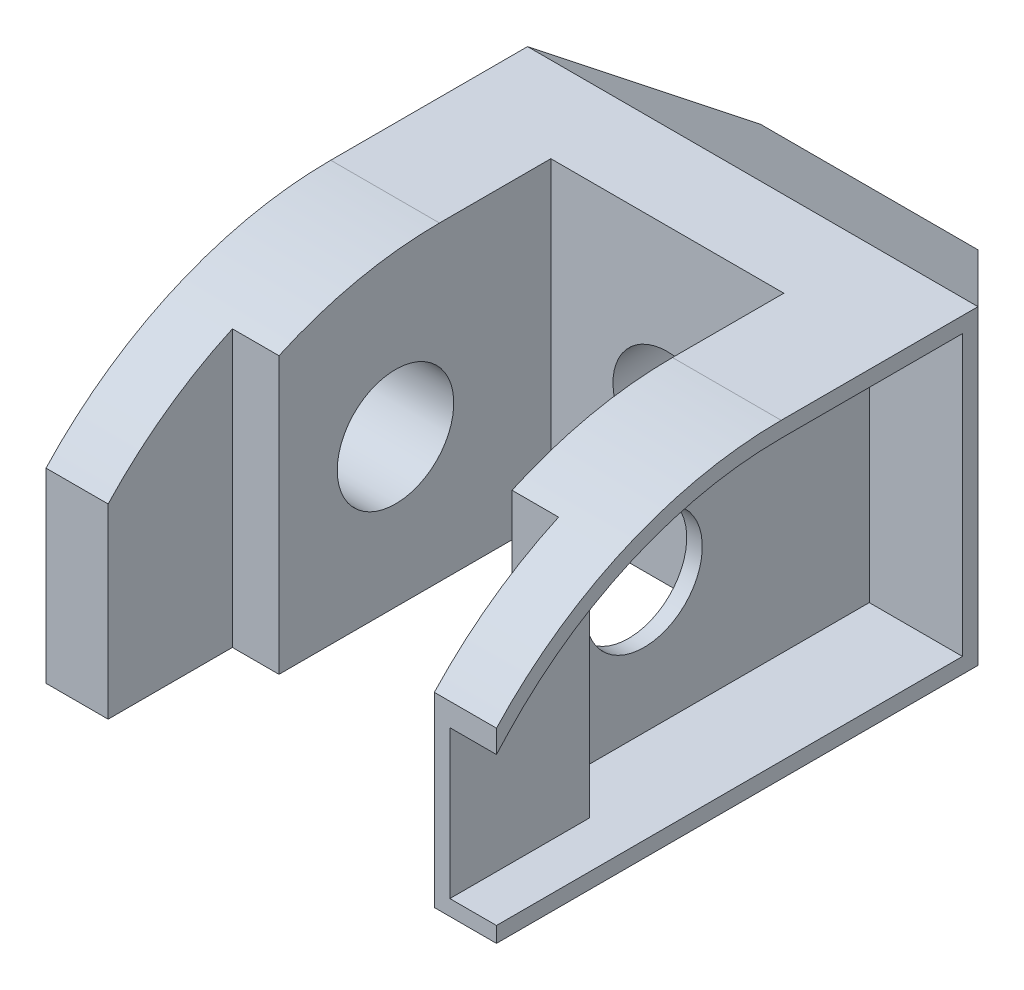
ISO-10303-21;
HEADER;
FILE_DESCRIPTION(('STEP AP214'),'2;1');
FILE_NAME('part.step','',(''),(''),'','','');
FILE_SCHEMA(('AUTOMOTIVE_DESIGN { 1 0 10303 214 1 1 1 1 }'));
ENDSEC;
DATA;
#1=APPLICATION_CONTEXT('core data for automotive mechanical design processes');
#2=APPLICATION_PROTOCOL_DEFINITION('international standard','automotive_design',2000,#1);
#3=PRODUCT_CONTEXT('',#1,'mechanical');
#4=PRODUCT('Part','Part','',(#3));
#5=PRODUCT_RELATED_PRODUCT_CATEGORY('part','',(#4));
#6=PRODUCT_DEFINITION_FORMATION('','',#4);
#7=PRODUCT_DEFINITION_CONTEXT('part definition',#1,'design');
#8=PRODUCT_DEFINITION('design','',#6,#7);
#9=PRODUCT_DEFINITION_SHAPE('','',#8);
#10=(LENGTH_UNIT() NAMED_UNIT(*) SI_UNIT(.MILLI.,.METRE.));
#11=(NAMED_UNIT(*) PLANE_ANGLE_UNIT() SI_UNIT($,.RADIAN.));
#12=(NAMED_UNIT(*) SI_UNIT($,.STERADIAN.) SOLID_ANGLE_UNIT());
#13=UNCERTAINTY_MEASURE_WITH_UNIT(LENGTH_MEASURE(1.E-05),#10,'distance_accuracy_value','');
#14=(GEOMETRIC_REPRESENTATION_CONTEXT(3) GLOBAL_UNCERTAINTY_ASSIGNED_CONTEXT((#13)) GLOBAL_UNIT_ASSIGNED_CONTEXT((#10,
#11,#12)) REPRESENTATION_CONTEXT('',''));
#15=CARTESIAN_POINT('',(0.,0.,0.));
#16=DIRECTION('',(0.,0.,1.));
#17=DIRECTION('',(1.,0.,0.));
#18=AXIS2_PLACEMENT_3D('',#15,#16,#17);
#19=CARTESIAN_POINT('',(29.,0.,0.));
#20=DIRECTION('',(-1.,0.,0.));
#21=DIRECTION('',(0.,0.,1.));
#22=AXIS2_PLACEMENT_3D('',#19,#20,#21);
#23=CYLINDRICAL_SURFACE('',#22,7.5);
#24=CARTESIAN_POINT('',(15.,0.,0.));
#25=DIRECTION('',(1.,0.,0.));
#26=DIRECTION('',(0.,0.,-1.));
#27=AXIS2_PLACEMENT_3D('',#24,#25,#26);
#28=CIRCLE('',#27,7.5);
#29=CARTESIAN_POINT('',(15.,0.,7.5));
#30=VERTEX_POINT('',#29);
#31=EDGE_CURVE('E355',#30,#30,#28,.T.);
#32=CARTESIAN_POINT('',(17.,0.,0.));
#33=DIRECTION('',(1.,0.,0.));
#34=DIRECTION('',(0.,0.,-1.));
#35=AXIS2_PLACEMENT_3D('',#32,#33,#34);
#36=CIRCLE('',#35,7.5);
#37=CARTESIAN_POINT('',(17.,0.,7.5));
#38=VERTEX_POINT('',#37);
#39=EDGE_CURVE('E50',#38,#38,#36,.T.);
#40=CARTESIAN_POINT('',(15.,0.,7.5));
#41=CARTESIAN_POINT('',(15.0208333333333,0.,7.5));
#42=CARTESIAN_POINT('',(15.0416666666667,0.,7.5));
#43=CARTESIAN_POINT('',(15.0833333333333,0.,7.5));
#44=CARTESIAN_POINT('',(15.1041666666667,0.,7.5));
#45=CARTESIAN_POINT('',(15.1458333333333,0.,7.5));
#46=CARTESIAN_POINT('',(15.1666666666667,0.,7.5));
#47=CARTESIAN_POINT('',(15.2083333333333,0.,7.5));
#48=CARTESIAN_POINT('',(15.2291666666667,0.,7.5));
#49=CARTESIAN_POINT('',(15.2708333333333,0.,7.5));
#50=CARTESIAN_POINT('',(15.2916666666667,0.,7.5));
#51=CARTESIAN_POINT('',(15.3333333333333,0.,7.5));
#52=CARTESIAN_POINT('',(15.3541666666667,0.,7.5));
#53=CARTESIAN_POINT('',(15.3958333333333,0.,7.5));
#54=CARTESIAN_POINT('',(15.4166666666667,0.,7.5));
#55=CARTESIAN_POINT('',(15.4583333333333,0.,7.5));
#56=CARTESIAN_POINT('',(15.4791666666667,0.,7.5));
#57=CARTESIAN_POINT('',(15.5208333333333,0.,7.5));
#58=CARTESIAN_POINT('',(15.5416666666667,0.,7.5));
#59=CARTESIAN_POINT('',(15.5833333333333,0.,7.5));
#60=CARTESIAN_POINT('',(15.6041666666667,0.,7.5));
#61=CARTESIAN_POINT('',(15.6458333333333,0.,7.5));
#62=CARTESIAN_POINT('',(15.6666666666667,0.,7.5));
#63=CARTESIAN_POINT('',(15.7083333333333,0.,7.5));
#64=CARTESIAN_POINT('',(15.7291666666667,0.,7.5));
#65=CARTESIAN_POINT('',(15.7708333333333,0.,7.5));
#66=CARTESIAN_POINT('',(15.7916666666667,0.,7.5));
#67=CARTESIAN_POINT('',(15.8333333333333,0.,7.5));
#68=CARTESIAN_POINT('',(15.8541666666667,0.,7.5));
#69=CARTESIAN_POINT('',(15.8958333333333,0.,7.5));
#70=CARTESIAN_POINT('',(15.9166666666667,0.,7.5));
#71=CARTESIAN_POINT('',(15.9583333333333,0.,7.5));
#72=CARTESIAN_POINT('',(15.9791666666667,0.,7.5));
#73=CARTESIAN_POINT('',(16.0208333333333,0.,7.5));
#74=CARTESIAN_POINT('',(16.0416666666667,0.,7.5));
#75=CARTESIAN_POINT('',(16.0833333333333,0.,7.5));
#76=CARTESIAN_POINT('',(16.1041666666667,0.,7.5));
#77=CARTESIAN_POINT('',(16.1458333333333,0.,7.5));
#78=CARTESIAN_POINT('',(16.1666666666667,0.,7.5));
#79=CARTESIAN_POINT('',(16.2083333333333,0.,7.5));
#80=CARTESIAN_POINT('',(16.2291666666667,0.,7.5));
#81=CARTESIAN_POINT('',(16.2708333333333,0.,7.5));
#82=CARTESIAN_POINT('',(16.2916666666667,0.,7.5));
#83=CARTESIAN_POINT('',(16.3333333333333,0.,7.5));
#84=CARTESIAN_POINT('',(16.3541666666667,0.,7.5));
#85=CARTESIAN_POINT('',(16.3958333333333,0.,7.5));
#86=CARTESIAN_POINT('',(16.4166666666667,0.,7.5));
#87=CARTESIAN_POINT('',(16.4583333333333,0.,7.5));
#88=CARTESIAN_POINT('',(16.4791666666667,0.,7.5));
#89=CARTESIAN_POINT('',(16.5208333333333,0.,7.5));
#90=CARTESIAN_POINT('',(16.5416666666667,0.,7.5));
#91=CARTESIAN_POINT('',(16.5833333333333,0.,7.5));
#92=CARTESIAN_POINT('',(16.6041666666667,0.,7.5));
#93=CARTESIAN_POINT('',(16.6458333333333,0.,7.5));
#94=CARTESIAN_POINT('',(16.6666666666667,0.,7.5));
#95=CARTESIAN_POINT('',(16.7083333333333,0.,7.5));
#96=CARTESIAN_POINT('',(16.7291666666667,0.,7.5));
#97=CARTESIAN_POINT('',(16.7708333333333,0.,7.5));
#98=CARTESIAN_POINT('',(16.7916666666667,0.,7.5));
#99=CARTESIAN_POINT('',(16.8333333333333,0.,7.5));
#100=CARTESIAN_POINT('',(16.8541666666667,0.,7.5));
#101=CARTESIAN_POINT('',(16.8958333333333,0.,7.5));
#102=CARTESIAN_POINT('',(16.9166666666667,0.,7.5));
#103=CARTESIAN_POINT('',(16.9583333333333,0.,7.5));
#104=CARTESIAN_POINT('',(16.9791666666667,0.,7.5));
#105=CARTESIAN_POINT('',(17.,0.,7.5));
#106=B_SPLINE_CURVE_WITH_KNOTS('',3,(#40,#41,#42,#43,#44,#45,#46,#47,#48,#49,#50,#51,#52,#53,
#54,#55,#56,#57,#58,#59,#60,#61,#62,#63,#64,#65,#66,#67,#68,#69,#70,#71,#72,#73,#74,#75,#76,#77,
#78,#79,#80,#81,#82,#83,#84,#85,#86,#87,#88,#89,#90,#91,#92,#93,#94,#95,#96,#97,#98,#99,#100,
#101,#102,#103,#104,#105),.UNSPECIFIED.,.F.,.F.,(4,2,2,2,2,2,2,2,2,2,2,2,2,2,2,2,2,2,2,2,2,2,2,
2,2,2,2,2,2,2,2,2,4),(0.,0.0625000000000001,0.125,0.1875,0.25,0.3125,0.375,0.4375,0.5,
0.562499999999999,0.624999999999999,0.687499999999999,0.749999999999999,0.812499999999999,
0.874999999999999,0.937499999999999,0.999999999999999,1.0625,1.125,1.1875,1.25,1.3125,1.375,
1.4375,1.5,1.5625,1.625,1.6875,1.75,1.8125,1.875,1.9375,2.),.UNSPECIFIED.);
#107=EDGE_CURVE('BSEAM46',#30,#38,#106,.T.);
#108=ORIENTED_EDGE('',*,*,#31,.F.);
#109=ORIENTED_EDGE('',*,*,#39,.T.);
#110=ORIENTED_EDGE('',*,*,#107,.T.);
#111=ORIENTED_EDGE('',*,*,#107,.F.);
#112=EDGE_LOOP('',(#108,#110,#109,#111));
#113=FACE_BOUND('',#112,.T.);
#114=ADVANCED_FACE('F46',(#113),#23,.F.);
#115=CARTESIAN_POINT('',(29.,-29.,-5.66060555964671));
#116=DIRECTION('',(-1.,0.,0.));
#117=DIRECTION('',(0.,0.,1.));
#118=AXIS2_PLACEMENT_3D('',#115,#116,#117);
#119=CYLINDRICAL_SURFACE('',#118,50.);
#120=DIRECTION('',(-1.,0.,0.));
#121=VECTOR('',#120,1.);
#122=CARTESIAN_POINT('',(29.,5.,31.));
#123=LINE('',#122,#121);
#124=CARTESIAN_POINT('',(-21.,4.99999999999999,31.));
#125=VERTEX_POINT('',#124);
#126=CARTESIAN_POINT('',(-29.,5.,31.));
#127=VERTEX_POINT('',#126);
#128=EDGE_CURVE('E464',#125,#127,#123,.T.);
#129=ORIENTED_EDGE('',*,*,#128,.F.);
#130=CARTESIAN_POINT('',(-21.,-29.,-5.66060555964671));
#131=DIRECTION('',(-1.,0.,0.));
#132=DIRECTION('',(0.,0.,1.));
#133=AXIS2_PLACEMENT_3D('',#130,#131,#132);
#134=CIRCLE('',#133,50.);
#135=CARTESIAN_POINT('',(-21.,16.5317403347236,15.));
#136=VERTEX_POINT('',#135);
#137=EDGE_CURVE('E372',#125,#136,#134,.T.);
#138=ORIENTED_EDGE('',*,*,#137,.T.);
#139=DIRECTION('',(-1.,0.,0.));
#140=VECTOR('',#139,1.);
#141=CARTESIAN_POINT('',(29.,16.5317403347236,15.));
#142=LINE('',#141,#140);
#143=CARTESIAN_POINT('',(-15.,16.5317403347236,15.));
#144=VERTEX_POINT('',#143);
#145=EDGE_CURVE('E368',#136,#144,#142,.F.);
#146=ORIENTED_EDGE('',*,*,#145,.T.);
#147=CARTESIAN_POINT('',(-15.,-29.,-5.66060555964671));
#148=DIRECTION('',(-1.,0.,0.));
#149=DIRECTION('',(0.,0.,1.));
#150=AXIS2_PLACEMENT_3D('',#147,#148,#149);
#151=CIRCLE('',#150,50.);
#152=CARTESIAN_POINT('',(-15.,21.,-5.66060555964671));
#153=VERTEX_POINT('',#152);
#154=EDGE_CURVE('E356',#144,#153,#151,.T.);
#155=ORIENTED_EDGE('',*,*,#154,.T.);
#156=DIRECTION('',(-1.,0.,0.));
#157=VECTOR('',#156,1.);
#158=CARTESIAN_POINT('',(29.,21.,-5.66060555964671));
#159=LINE('',#158,#157);
#160=CARTESIAN_POINT('',(-29.,21.,-5.66060555964671));
#161=VERTEX_POINT('',#160);
#162=EDGE_CURVE('E424',#153,#161,#159,.T.);
#163=ORIENTED_EDGE('',*,*,#162,.T.);
#164=CARTESIAN_POINT('',(-29.,-29.,-5.66060555964671));
#165=DIRECTION('',(1.,0.,0.));
#166=DIRECTION('',(0.,0.,-1.));
#167=AXIS2_PLACEMENT_3D('',#164,#165,#166);
#168=CIRCLE('',#167,50.);
#169=EDGE_CURVE('E406',#161,#127,#168,.T.);
#170=ORIENTED_EDGE('',*,*,#169,.T.);
#171=EDGE_LOOP('',(#129,#138,#146,#155,#163,#170));
#172=FACE_BOUND('',#171,.T.);
#173=ADVANCED_FACE('F502',(#172),#119,.T.);
#174=CARTESIAN_POINT('',(29.,5.,31.));
#175=DIRECTION('',(0.,0.,-1.));
#176=DIRECTION('',(-1.,0.,0.));
#177=AXIS2_PLACEMENT_3D('',#174,#175,#176);
#178=PLANE('',#177);
#179=DIRECTION('',(-1.,0.,0.));
#180=VECTOR('',#179,1.);
#181=CARTESIAN_POINT('',(29.,-19.,31.));
#182=LINE('',#181,#180);
#183=CARTESIAN_POINT('',(-21.,-19.,31.));
#184=VERTEX_POINT('',#183);
#185=CARTESIAN_POINT('',(-29.,-19.,31.));
#186=VERTEX_POINT('',#185);
#187=EDGE_CURVE('E459',#184,#186,#182,.T.);
#188=ORIENTED_EDGE('',*,*,#187,.F.);
#189=DIRECTION('',(0.,1.,0.));
#190=VECTOR('',#189,1.);
#191=CARTESIAN_POINT('',(-21.,-19.,31.));
#192=LINE('',#191,#190);
#193=EDGE_CURVE('E311',#184,#125,#192,.T.);
#194=ORIENTED_EDGE('',*,*,#193,.T.);
#195=ORIENTED_EDGE('',*,*,#128,.T.);
#196=DIRECTION('',(0.,-1.,0.));
#197=VECTOR('',#196,1.);
#198=CARTESIAN_POINT('',(-29.,5.,31.));
#199=LINE('',#198,#197);
#200=EDGE_CURVE('E428',#127,#186,#199,.T.);
#201=ORIENTED_EDGE('',*,*,#200,.T.);
#202=EDGE_LOOP('',(#188,#194,#195,#201));
#203=FACE_BOUND('',#202,.T.);
#204=ADVANCED_FACE('F488',(#203),#178,.F.);
#205=CARTESIAN_POINT('',(-15.,0.,0.));
#206=DIRECTION('',(-1.,0.,0.));
#207=DIRECTION('',(0.,0.,1.));
#208=AXIS2_PLACEMENT_3D('',#205,#206,#207);
#209=CIRCLE('',#208,7.5);
#210=CARTESIAN_POINT('',(-15.,0.,7.5));
#211=VERTEX_POINT('',#210);
#212=EDGE_CURVE('E354',#211,#211,#209,.T.);
#213=CARTESIAN_POINT('',(-29.,0.,0.));
#214=DIRECTION('',(1.,0.,0.));
#215=DIRECTION('',(0.,0.,-1.));
#216=AXIS2_PLACEMENT_3D('',#213,#214,#215);
#217=CIRCLE('',#216,7.5);
#218=CARTESIAN_POINT('',(-29.,0.,7.5));
#219=VERTEX_POINT('',#218);
#220=EDGE_CURVE('E402',#219,#219,#217,.T.);
#221=CARTESIAN_POINT('',(-15.,0.,7.5));
#222=CARTESIAN_POINT('',(-15.1458333333333,0.,7.5));
#223=CARTESIAN_POINT('',(-15.2916666666667,0.,7.5));
#224=CARTESIAN_POINT('',(-15.5833333333333,0.,7.5));
#225=CARTESIAN_POINT('',(-15.7291666666667,0.,7.5));
#226=CARTESIAN_POINT('',(-16.0208333333333,0.,7.5));
#227=CARTESIAN_POINT('',(-16.1666666666667,0.,7.5));
#228=CARTESIAN_POINT('',(-16.4583333333333,0.,7.5));
#229=CARTESIAN_POINT('',(-16.6041666666667,0.,7.5));
#230=CARTESIAN_POINT('',(-16.8958333333333,0.,7.5));
#231=CARTESIAN_POINT('',(-17.0416666666667,0.,7.5));
#232=CARTESIAN_POINT('',(-17.3333333333333,0.,7.5));
#233=CARTESIAN_POINT('',(-17.4791666666667,0.,7.5));
#234=CARTESIAN_POINT('',(-17.7708333333333,0.,7.5));
#235=CARTESIAN_POINT('',(-17.9166666666667,0.,7.5));
#236=CARTESIAN_POINT('',(-18.2083333333333,0.,7.5));
#237=CARTESIAN_POINT('',(-18.3541666666667,0.,7.5));
#238=CARTESIAN_POINT('',(-18.6458333333333,0.,7.5));
#239=CARTESIAN_POINT('',(-18.7916666666667,0.,7.5));
#240=CARTESIAN_POINT('',(-19.0833333333333,0.,7.5));
#241=CARTESIAN_POINT('',(-19.2291666666667,0.,7.5));
#242=CARTESIAN_POINT('',(-19.5208333333333,0.,7.5));
#243=CARTESIAN_POINT('',(-19.6666666666667,0.,7.5));
#244=CARTESIAN_POINT('',(-19.9583333333333,0.,7.5));
#245=CARTESIAN_POINT('',(-20.1041666666667,0.,7.5));
#246=CARTESIAN_POINT('',(-20.3958333333333,0.,7.5));
#247=CARTESIAN_POINT('',(-20.5416666666667,0.,7.5));
#248=CARTESIAN_POINT('',(-20.8333333333333,0.,7.5));
#249=CARTESIAN_POINT('',(-20.9791666666667,0.,7.5));
#250=CARTESIAN_POINT('',(-21.2708333333333,0.,7.5));
#251=CARTESIAN_POINT('',(-21.4166666666667,0.,7.5));
#252=CARTESIAN_POINT('',(-21.7083333333333,0.,7.5));
#253=CARTESIAN_POINT('',(-21.8541666666667,0.,7.5));
#254=CARTESIAN_POINT('',(-22.1458333333333,0.,7.5));
#255=CARTESIAN_POINT('',(-22.2916666666667,0.,7.5));
#256=CARTESIAN_POINT('',(-22.5833333333333,0.,7.5));
#257=CARTESIAN_POINT('',(-22.7291666666667,0.,7.5));
#258=CARTESIAN_POINT('',(-23.0208333333333,0.,7.5));
#259=CARTESIAN_POINT('',(-23.1666666666667,0.,7.5));
#260=CARTESIAN_POINT('',(-23.4583333333333,0.,7.5));
#261=CARTESIAN_POINT('',(-23.6041666666667,0.,7.5));
#262=CARTESIAN_POINT('',(-23.8958333333333,0.,7.5));
#263=CARTESIAN_POINT('',(-24.0416666666667,0.,7.5));
#264=CARTESIAN_POINT('',(-24.3333333333333,0.,7.5));
#265=CARTESIAN_POINT('',(-24.4791666666667,0.,7.5));
#266=CARTESIAN_POINT('',(-24.7708333333333,0.,7.5));
#267=CARTESIAN_POINT('',(-24.9166666666667,0.,7.5));
#268=CARTESIAN_POINT('',(-25.2083333333333,0.,7.5));
#269=CARTESIAN_POINT('',(-25.3541666666667,0.,7.5));
#270=CARTESIAN_POINT('',(-25.6458333333333,0.,7.5));
#271=CARTESIAN_POINT('',(-25.7916666666667,0.,7.5));
#272=CARTESIAN_POINT('',(-26.0833333333333,0.,7.5));
#273=CARTESIAN_POINT('',(-26.2291666666667,0.,7.5));
#274=CARTESIAN_POINT('',(-26.5208333333333,0.,7.5));
#275=CARTESIAN_POINT('',(-26.6666666666667,0.,7.5));
#276=CARTESIAN_POINT('',(-26.9583333333333,0.,7.5));
#277=CARTESIAN_POINT('',(-27.1041666666667,0.,7.5));
#278=CARTESIAN_POINT('',(-27.3958333333333,0.,7.5));
#279=CARTESIAN_POINT('',(-27.5416666666667,0.,7.5));
#280=CARTESIAN_POINT('',(-27.8333333333333,0.,7.5));
#281=CARTESIAN_POINT('',(-27.9791666666667,0.,7.5));
#282=CARTESIAN_POINT('',(-28.2708333333333,0.,7.5));
#283=CARTESIAN_POINT('',(-28.4166666666667,0.,7.5));
#284=CARTESIAN_POINT('',(-28.7083333333333,0.,7.5));
#285=CARTESIAN_POINT('',(-28.8541666666667,0.,7.5));
#286=CARTESIAN_POINT('',(-29.,0.,7.5));
#287=B_SPLINE_CURVE_WITH_KNOTS('',3,(#221,#222,#223,#224,#225,#226,#227,#228,#229,#230,#231,
#232,#233,#234,#235,#236,#237,#238,#239,#240,#241,#242,#243,#244,#245,#246,#247,#248,#249,#250,
#251,#252,#253,#254,#255,#256,#257,#258,#259,#260,#261,#262,#263,#264,#265,#266,#267,#268,#269,
#270,#271,#272,#273,#274,#275,#276,#277,#278,#279,#280,#281,#282,#283,#284,#285,#286),
.UNSPECIFIED.,.F.,.F.,(4,2,2,2,2,2,2,2,2,2,2,2,2,2,2,2,2,2,2,2,2,2,2,2,2,2,2,2,2,2,2,2,4),(0.,
0.4375,0.875000000000001,1.3125,1.75,2.1875,2.625,3.0625,3.5,3.9375,4.375,4.8125,5.25,
5.68750000000001,6.12500000000001,6.56250000000001,7.00000000000001,7.43750000000001,
7.87500000000001,8.31250000000001,8.75000000000001,9.18750000000001,9.62500000000001,10.0625,
10.5,10.9375,11.375,11.8125,12.25,12.6875,13.125,13.5625,14.),.UNSPECIFIED.);
#288=EDGE_CURVE('BSEAM484',#211,#219,#287,.T.);
#289=ORIENTED_EDGE('',*,*,#212,.F.);
#290=ORIENTED_EDGE('',*,*,#220,.F.);
#291=ORIENTED_EDGE('',*,*,#288,.T.);
#292=ORIENTED_EDGE('',*,*,#288,.F.);
#293=EDGE_LOOP('',(#289,#291,#290,#292));
#294=FACE_BOUND('',#293,.T.);
#295=ADVANCED_FACE('F484',(#294),#23,.F.);
#296=CARTESIAN_POINT('',(29.,-29.,-5.66060555964671));
#297=DIRECTION('',(1.,0.,0.));
#298=DIRECTION('',(0.,0.,-1.));
#299=AXIS2_PLACEMENT_3D('',#296,#297,#298);
#300=PLANE('',#299);
#301=DIRECTION('',(0.,-0.733212111192934,0.680000000000001));
#302=VECTOR('',#301,1.);
#303=CARTESIAN_POINT('',(29.,3.63999999999999,29.5335757776141));
#304=LINE('',#303,#302);
#305=CARTESIAN_POINT('',(29.,3.63999999999999,29.5335757776141));
#306=VERTEX_POINT('',#305);
#307=CARTESIAN_POINT('',(29.,2.05882352941176,31.));
#308=VERTEX_POINT('',#307);
#309=EDGE_CURVE('E247',#306,#308,#304,.T.);
#310=ORIENTED_EDGE('',*,*,#309,.F.);
#311=CARTESIAN_POINT('',(29.,-29.,-5.66060555964671));
#312=DIRECTION('',(1.,0.,0.));
#313=DIRECTION('',(0.,0.,-1.));
#314=AXIS2_PLACEMENT_3D('',#311,#312,#313);
#315=CIRCLE('',#314,48.);
#316=CARTESIAN_POINT('',(29.,19.,-5.66060555964671));
#317=VERTEX_POINT('',#316);
#318=EDGE_CURVE('E262',#317,#306,#315,.T.);
#319=ORIENTED_EDGE('',*,*,#318,.F.);
#320=DIRECTION('',(0.,0.,1.));
#321=VECTOR('',#320,1.);
#322=CARTESIAN_POINT('',(29.,19.,-29.));
#323=LINE('',#322,#321);
#324=CARTESIAN_POINT('',(29.,19.,-29.));
#325=VERTEX_POINT('',#324);
#326=EDGE_CURVE('E258',#325,#317,#323,.T.);
#327=ORIENTED_EDGE('',*,*,#326,.F.);
#328=DIRECTION('',(0.,1.,0.));
#329=VECTOR('',#328,1.);
#330=CARTESIAN_POINT('',(29.,-17.,-29.));
#331=LINE('',#330,#329);
#332=CARTESIAN_POINT('',(29.,-17.,-29.));
#333=VERTEX_POINT('',#332);
#334=EDGE_CURVE('E254',#333,#325,#331,.T.);
#335=ORIENTED_EDGE('',*,*,#334,.F.);
#336=DIRECTION('',(0.,0.,-1.));
#337=VECTOR('',#336,1.);
#338=CARTESIAN_POINT('',(29.,-17.,31.));
#339=LINE('',#338,#337);
#340=CARTESIAN_POINT('',(29.,-17.,31.));
#341=VERTEX_POINT('',#340);
#342=EDGE_CURVE('E250',#341,#333,#339,.T.);
#343=ORIENTED_EDGE('',*,*,#342,.F.);
#344=DIRECTION('',(0.,-1.,0.));
#345=VECTOR('',#344,1.);
#346=CARTESIAN_POINT('',(29.,5.,31.));
#347=LINE('',#346,#345);
#348=CARTESIAN_POINT('',(29.,-19.,31.));
#349=VERTEX_POINT('',#348);
#350=EDGE_CURVE('E411',#341,#349,#347,.T.);
#351=ORIENTED_EDGE('',*,*,#350,.T.);
#352=DIRECTION('',(0.,0.,-1.));
#353=VECTOR('',#352,1.);
#354=CARTESIAN_POINT('',(29.,-19.,31.));
#355=LINE('',#354,#353);
#356=CARTESIAN_POINT('',(29.,-19.,-31.));
#357=VERTEX_POINT('',#356);
#358=EDGE_CURVE('E417',#349,#357,#355,.T.);
#359=ORIENTED_EDGE('',*,*,#358,.T.);
#360=DIRECTION('',(0.,1.,0.));
#361=VECTOR('',#360,1.);
#362=CARTESIAN_POINT('',(29.,-19.,-31.));
#363=LINE('',#362,#361);
#364=CARTESIAN_POINT('',(29.,21.,-31.));
#365=VERTEX_POINT('',#364);
#366=EDGE_CURVE('E389',#357,#365,#363,.T.);
#367=ORIENTED_EDGE('',*,*,#366,.T.);
#368=DIRECTION('',(0.,0.,1.));
#369=VECTOR('',#368,1.);
#370=CARTESIAN_POINT('',(29.,21.,-31.));
#371=LINE('',#370,#369);
#372=CARTESIAN_POINT('',(29.,21.,-5.66060555964671));
#373=VERTEX_POINT('',#372);
#374=EDGE_CURVE('E421',#365,#373,#371,.T.);
#375=ORIENTED_EDGE('',*,*,#374,.T.);
#376=CARTESIAN_POINT('',(29.,-29.,-5.66060555964671));
#377=DIRECTION('',(1.,0.,0.));
#378=DIRECTION('',(0.,0.,-1.));
#379=AXIS2_PLACEMENT_3D('',#376,#377,#378);
#380=CIRCLE('',#379,50.);
#381=CARTESIAN_POINT('',(29.,5.,31.));
#382=VERTEX_POINT('',#381);
#383=EDGE_CURVE('E407',#373,#382,#380,.T.);
#384=ORIENTED_EDGE('',*,*,#383,.T.);
#385=EDGE_CURVE('E413',#382,#308,#347,.T.);
#386=ORIENTED_EDGE('',*,*,#385,.T.);
#387=EDGE_LOOP('',(#310,#319,#327,#335,#343,#351,#359,#367,#375,#384,#386));
#388=FACE_BOUND('',#387,.T.);
#389=ADVANCED_FACE('F487',(#388),#300,.T.);
#390=CARTESIAN_POINT('',(-29.,-29.,-5.66060555964671));
#391=DIRECTION('',(1.,0.,0.));
#392=DIRECTION('',(0.,0.,-1.));
#393=AXIS2_PLACEMENT_3D('',#390,#391,#392);
#394=PLANE('',#393);
#395=DIRECTION('',(0.,0.,1.));
#396=VECTOR('',#395,1.);
#397=CARTESIAN_POINT('',(-29.,21.,-31.));
#398=LINE('',#397,#396);
#399=CARTESIAN_POINT('',(-29.,21.,-31.));
#400=VERTEX_POINT('',#399);
#401=EDGE_CURVE('E412',#400,#161,#398,.T.);
#402=ORIENTED_EDGE('',*,*,#401,.F.);
#403=DIRECTION('',(0.,1.,0.));
#404=VECTOR('',#403,1.);
#405=CARTESIAN_POINT('',(-29.,-19.,-31.));
#406=LINE('',#405,#404);
#407=CARTESIAN_POINT('',(-29.,-19.,-31.));
#408=VERTEX_POINT('',#407);
#409=EDGE_CURVE('E386',#408,#400,#406,.T.);
#410=ORIENTED_EDGE('',*,*,#409,.F.);
#411=DIRECTION('',(0.,0.,-1.));
#412=VECTOR('',#411,1.);
#413=CARTESIAN_POINT('',(-29.,-19.,31.));
#414=LINE('',#413,#412);
#415=EDGE_CURVE('E432',#186,#408,#414,.T.);
#416=ORIENTED_EDGE('',*,*,#415,.F.);
#417=ORIENTED_EDGE('',*,*,#200,.F.);
#418=ORIENTED_EDGE('',*,*,#169,.F.);
#419=EDGE_LOOP('',(#402,#410,#416,#417,#418));
#420=FACE_BOUND('',#419,.T.);
#421=ORIENTED_EDGE('',*,*,#220,.T.);
#422=EDGE_LOOP('',(#421));
#423=FACE_BOUND('',#422,.T.);
#424=ADVANCED_FACE('F492',(#420,#423),#394,.F.);
#425=CARTESIAN_POINT('',(15.,21.,-5.66060555964671));
#426=VERTEX_POINT('',#425);
#427=EDGE_CURVE('E439',#373,#426,#159,.T.);
#428=ORIENTED_EDGE('',*,*,#427,.T.);
#429=CARTESIAN_POINT('',(15.,-29.,-5.66060555964671));
#430=DIRECTION('',(1.,0.,0.));
#431=DIRECTION('',(0.,0.,-1.));
#432=AXIS2_PLACEMENT_3D('',#429,#430,#431);
#433=CIRCLE('',#432,50.);
#434=CARTESIAN_POINT('',(15.,16.5317403347236,15.));
#435=VERTEX_POINT('',#434);
#436=EDGE_CURVE('E350',#426,#435,#433,.T.);
#437=ORIENTED_EDGE('',*,*,#436,.T.);
#438=DIRECTION('',(-1.,0.,0.));
#439=VECTOR('',#438,1.);
#440=CARTESIAN_POINT('',(29.,16.5317403347236,15.));
#441=LINE('',#440,#439);
#442=CARTESIAN_POINT('',(21.,16.5317403347236,15.));
#443=VERTEX_POINT('',#442);
#444=EDGE_CURVE('E364',#435,#443,#441,.F.);
#445=ORIENTED_EDGE('',*,*,#444,.T.);
#446=CARTESIAN_POINT('',(21.,-29.,-5.66060555964671));
#447=DIRECTION('',(1.,0.,0.));
#448=DIRECTION('',(0.,0.,-1.));
#449=AXIS2_PLACEMENT_3D('',#446,#447,#448);
#450=CIRCLE('',#449,50.);
#451=CARTESIAN_POINT('',(21.,4.99999999999999,31.));
#452=VERTEX_POINT('',#451);
#453=EDGE_CURVE('E360',#443,#452,#450,.T.);
#454=ORIENTED_EDGE('',*,*,#453,.T.);
#455=EDGE_CURVE('E465',#382,#452,#123,.T.);
#456=ORIENTED_EDGE('',*,*,#455,.F.);
#457=ORIENTED_EDGE('',*,*,#383,.F.);
#458=EDGE_LOOP('',(#428,#437,#445,#454,#456,#457));
#459=FACE_BOUND('',#458,.T.);
#460=ADVANCED_FACE('F48',(#459),#119,.T.);
#461=DIRECTION('',(0.,1.,0.));
#462=VECTOR('',#461,1.);
#463=CARTESIAN_POINT('',(23.,2.05882352941176,31.));
#464=LINE('',#463,#462);
#465=CARTESIAN_POINT('',(23.,-17.,31.));
#466=VERTEX_POINT('',#465);
#467=CARTESIAN_POINT('',(23.,2.05882352941176,31.));
#468=VERTEX_POINT('',#467);
#469=EDGE_CURVE('E229',#466,#468,#464,.T.);
#470=ORIENTED_EDGE('',*,*,#469,.T.);
#471=DIRECTION('',(1.,0.,0.));
#472=VECTOR('',#471,1.);
#473=CARTESIAN_POINT('',(-48.9714227381436,2.05882352941176,31.));
#474=LINE('',#473,#472);
#475=EDGE_CURVE('E72',#468,#308,#474,.T.);
#476=ORIENTED_EDGE('',*,*,#475,.T.);
#477=ORIENTED_EDGE('',*,*,#385,.F.);
#478=ORIENTED_EDGE('',*,*,#455,.T.);
#479=DIRECTION('',(0.,1.,0.));
#480=VECTOR('',#479,1.);
#481=CARTESIAN_POINT('',(21.,-19.,31.));
#482=LINE('',#481,#480);
#483=CARTESIAN_POINT('',(21.,-19.,31.));
#484=VERTEX_POINT('',#483);
#485=EDGE_CURVE('E344',#484,#452,#482,.T.);
#486=ORIENTED_EDGE('',*,*,#485,.F.);
#487=EDGE_CURVE('E460',#349,#484,#182,.T.);
#488=ORIENTED_EDGE('',*,*,#487,.F.);
#489=ORIENTED_EDGE('',*,*,#350,.F.);
#490=DIRECTION('',(1.,0.,0.));
#491=VECTOR('',#490,1.);
#492=CARTESIAN_POINT('',(-48.9714227381436,-17.,31.));
#493=LINE('',#492,#491);
#494=EDGE_CURVE('E274',#466,#341,#493,.T.);
#495=ORIENTED_EDGE('',*,*,#494,.F.);
#496=EDGE_LOOP('',(#470,#476,#477,#478,#486,#488,#489,#495));
#497=FACE_BOUND('',#496,.T.);
#498=ADVANCED_FACE('F500',(#497),#178,.F.);
#499=CARTESIAN_POINT('',(29.,-19.,31.));
#500=DIRECTION('',(0.,1.,0.));
#501=DIRECTION('',(0.,0.,1.));
#502=AXIS2_PLACEMENT_3D('',#499,#500,#501);
#503=PLANE('',#502);
#504=DIRECTION('',(-1.,0.,0.));
#505=VECTOR('',#504,1.);
#506=CARTESIAN_POINT('',(-21.,-19.,15.));
#507=LINE('',#506,#505);
#508=CARTESIAN_POINT('',(-15.,-19.,15.));
#509=VERTEX_POINT('',#508);
#510=CARTESIAN_POINT('',(-21.,-19.,15.));
#511=VERTEX_POINT('',#510);
#512=EDGE_CURVE('E307',#509,#511,#507,.T.);
#513=ORIENTED_EDGE('',*,*,#512,.T.);
#514=DIRECTION('',(0.,0.,1.));
#515=VECTOR('',#514,1.);
#516=CARTESIAN_POINT('',(-21.,-19.,31.));
#517=LINE('',#516,#515);
#518=EDGE_CURVE('E282',#511,#184,#517,.T.);
#519=ORIENTED_EDGE('',*,*,#518,.T.);
#520=ORIENTED_EDGE('',*,*,#187,.T.);
#521=ORIENTED_EDGE('',*,*,#415,.T.);
#522=DIRECTION('',(-1.,0.,0.));
#523=VECTOR('',#522,1.);
#524=CARTESIAN_POINT('',(29.,-19.,-31.));
#525=LINE('',#524,#523);
#526=EDGE_CURVE('E455',#357,#408,#525,.T.);
#527=ORIENTED_EDGE('',*,*,#526,.F.);
#528=ORIENTED_EDGE('',*,*,#358,.F.);
#529=ORIENTED_EDGE('',*,*,#487,.T.);
#530=DIRECTION('',(0.,0.,-1.));
#531=VECTOR('',#530,1.);
#532=CARTESIAN_POINT('',(21.,-19.,15.));
#533=LINE('',#532,#531);
#534=CARTESIAN_POINT('',(21.,-19.,15.));
#535=VERTEX_POINT('',#534);
#536=EDGE_CURVE('E286',#484,#535,#533,.T.);
#537=ORIENTED_EDGE('',*,*,#536,.T.);
#538=DIRECTION('',(-1.,0.,0.));
#539=VECTOR('',#538,1.);
#540=CARTESIAN_POINT('',(15.,-19.,15.));
#541=LINE('',#540,#539);
#542=CARTESIAN_POINT('',(15.,-19.,15.));
#543=VERTEX_POINT('',#542);
#544=EDGE_CURVE('E291',#535,#543,#541,.T.);
#545=ORIENTED_EDGE('',*,*,#544,.T.);
#546=DIRECTION('',(0.,0.,-1.));
#547=VECTOR('',#546,1.);
#548=CARTESIAN_POINT('',(15.,-19.,-20.));
#549=LINE('',#548,#547);
#550=CARTESIAN_POINT('',(15.,-19.,-20.));
#551=VERTEX_POINT('',#550);
#552=EDGE_CURVE('E295',#543,#551,#549,.T.);
#553=ORIENTED_EDGE('',*,*,#552,.T.);
#554=DIRECTION('',(-1.,0.,0.));
#555=VECTOR('',#554,1.);
#556=CARTESIAN_POINT('',(-15.,-19.,-20.));
#557=LINE('',#556,#555);
#558=CARTESIAN_POINT('',(-15.,-19.,-20.));
#559=VERTEX_POINT('',#558);
#560=EDGE_CURVE('E299',#551,#559,#557,.T.);
#561=ORIENTED_EDGE('',*,*,#560,.T.);
#562=DIRECTION('',(0.,0.,1.));
#563=VECTOR('',#562,1.);
#564=CARTESIAN_POINT('',(-15.,-19.,15.));
#565=LINE('',#564,#563);
#566=EDGE_CURVE('E303',#559,#509,#565,.T.);
#567=ORIENTED_EDGE('',*,*,#566,.T.);
#568=EDGE_LOOP('',(#513,#519,#520,#521,#527,#528,#529,#537,#545,#553,#561,#567));
#569=FACE_BOUND('',#568,.T.);
#570=ADVANCED_FACE('F618',(#569),#503,.F.);
#571=CARTESIAN_POINT('',(29.,-19.,-31.));
#572=DIRECTION('',(0.,0.866025403784438,0.500000000000001));
#573=DIRECTION('',(0.,-0.500000000000001,0.866025403784438));
#574=AXIS2_PLACEMENT_3D('',#571,#572,#573);
#575=PLANE('',#574);
#576=ORIENTED_EDGE('',*,*,#526,.T.);
#577=DIRECTION('',(0.654653670707978,0.377964473009228,-0.654653670707976));
#578=VECTOR('',#577,1.);
#579=CARTESIAN_POINT('',(-4.14285714285709,-4.64872188014355,-55.8571428571429));
#580=LINE('',#579,#578);
#581=CARTESIAN_POINT('',(-14.,-10.3397459621556,-46.));
#582=VERTEX_POINT('',#581);
#583=EDGE_CURVE('E398',#408,#582,#580,.T.);
#584=ORIENTED_EDGE('',*,*,#583,.T.);
#585=DIRECTION('',(-1.,0.,0.));
#586=VECTOR('',#585,1.);
#587=CARTESIAN_POINT('',(29.,-10.3397459621556,-46.));
#588=LINE('',#587,#586);
#589=CARTESIAN_POINT('',(14.0000000000002,-10.3397459621556,-46.));
#590=VERTEX_POINT('',#589);
#591=EDGE_CURVE('E451',#590,#582,#588,.T.);
#592=ORIENTED_EDGE('',*,*,#591,.F.);
#593=DIRECTION('',(0.654653670707973,-0.37796447300923,0.65465367070798));
#594=VECTOR('',#593,1.);
#595=CARTESIAN_POINT('',(29.,-19.,-31.));
#596=LINE('',#595,#594);
#597=EDGE_CURVE('E385',#590,#357,#596,.T.);
#598=ORIENTED_EDGE('',*,*,#597,.T.);
#599=EDGE_LOOP('',(#576,#584,#592,#598));
#600=FACE_BOUND('',#599,.T.);
#601=ADVANCED_FACE('F621',(#600),#575,.F.);
#602=CARTESIAN_POINT('',(29.,-10.3397459621556,-46.));
#603=DIRECTION('',(0.,0.,1.));
#604=DIRECTION('',(0.,-1.,0.));
#605=AXIS2_PLACEMENT_3D('',#602,#603,#604);
#606=PLANE('',#605);
#607=CARTESIAN_POINT('',(0.,0.,-46.));
#608=DIRECTION('',(0.,0.,-1.));
#609=DIRECTION('',(0.,1.,0.));
#610=AXIS2_PLACEMENT_3D('',#607,#608,#609);
#611=CIRCLE('',#610,7.);
#612=CARTESIAN_POINT('',(0.,6.99999999999999,-46.));
#613=VERTEX_POINT('',#612);
#614=EDGE_CURVE('E376',#613,#613,#611,.T.);
#615=ORIENTED_EDGE('',*,*,#614,.F.);
#616=EDGE_LOOP('',(#615));
#617=FACE_BOUND('',#616,.T.);
#618=ORIENTED_EDGE('',*,*,#591,.T.);
#619=DIRECTION('',(0.,1.,0.));
#620=VECTOR('',#619,1.);
#621=CARTESIAN_POINT('',(-14.,-19.,-46.));
#622=LINE('',#621,#620);
#623=CARTESIAN_POINT('',(-14.,12.3397459621556,-46.));
#624=VERTEX_POINT('',#623);
#625=EDGE_CURVE('E381',#582,#624,#622,.T.);
#626=ORIENTED_EDGE('',*,*,#625,.T.);
#627=DIRECTION('',(-1.,0.,0.));
#628=VECTOR('',#627,1.);
#629=CARTESIAN_POINT('',(29.,12.3397459621556,-46.));
#630=LINE('',#629,#628);
#631=CARTESIAN_POINT('',(14.0000000000002,12.3397459621556,-46.));
#632=VERTEX_POINT('',#631);
#633=EDGE_CURVE('E447',#632,#624,#630,.T.);
#634=ORIENTED_EDGE('',*,*,#633,.F.);
#635=DIRECTION('',(0.,1.,0.));
#636=VECTOR('',#635,1.);
#637=CARTESIAN_POINT('',(14.0000000000002,-19.,-46.));
#638=LINE('',#637,#636);
#639=EDGE_CURVE('E380',#590,#632,#638,.T.);
#640=ORIENTED_EDGE('',*,*,#639,.F.);
#641=EDGE_LOOP('',(#618,#626,#634,#640));
#642=FACE_BOUND('',#641,.T.);
#643=ADVANCED_FACE('F626',(#617,#642),#606,.F.);
#644=CARTESIAN_POINT('',(29.,12.3397459621556,-46.));
#645=DIRECTION('',(0.,-0.866025403784438,0.500000000000001));
#646=DIRECTION('',(0.,-0.500000000000001,-0.866025403784438));
#647=AXIS2_PLACEMENT_3D('',#644,#645,#646);
#648=PLANE('',#647);
#649=ORIENTED_EDGE('',*,*,#633,.T.);
#650=DIRECTION('',(-0.654653670707978,0.377964473009227,0.654653670707976));
#651=VECTOR('',#650,1.);
#652=CARTESIAN_POINT('',(4.4285714285715,1.70000528708962,-64.4285714285714));
#653=LINE('',#652,#651);
#654=EDGE_CURVE('E13',#624,#400,#653,.T.);
#655=ORIENTED_EDGE('',*,*,#654,.T.);
#656=DIRECTION('',(-1.,0.,0.));
#657=VECTOR('',#656,1.);
#658=CARTESIAN_POINT('',(29.,21.,-31.));
#659=LINE('',#658,#657);
#660=EDGE_CURVE('E443',#365,#400,#659,.T.);
#661=ORIENTED_EDGE('',*,*,#660,.F.);
#662=DIRECTION('',(-0.654653670707973,-0.37796447300923,-0.65465367070798));
#663=VECTOR('',#662,1.);
#664=CARTESIAN_POINT('',(20.4285714285714,16.051283406946,-39.5714285714287));
#665=LINE('',#664,#663);
#666=EDGE_CURVE('E56',#365,#632,#665,.T.);
#667=ORIENTED_EDGE('',*,*,#666,.T.);
#668=EDGE_LOOP('',(#649,#655,#661,#667));
#669=FACE_BOUND('',#668,.T.);
#670=ADVANCED_FACE('F628',(#669),#648,.F.);
#671=CARTESIAN_POINT('',(29.,21.,-31.));
#672=DIRECTION('',(0.,-1.,0.));
#673=DIRECTION('',(0.,0.,-1.));
#674=AXIS2_PLACEMENT_3D('',#671,#672,#673);
#675=PLANE('',#674);
#676=ORIENTED_EDGE('',*,*,#162,.F.);
#677=DIRECTION('',(0.,0.,1.));
#678=VECTOR('',#677,1.);
#679=CARTESIAN_POINT('',(-15.,21.,15.));
#680=LINE('',#679,#678);
#681=CARTESIAN_POINT('',(-15.,21.,-20.));
#682=VERTEX_POINT('',#681);
#683=EDGE_CURVE('E287',#682,#153,#680,.T.);
#684=ORIENTED_EDGE('',*,*,#683,.F.);
#685=DIRECTION('',(-1.,0.,0.));
#686=VECTOR('',#685,1.);
#687=CARTESIAN_POINT('',(-15.,21.,-20.));
#688=LINE('',#687,#686);
#689=CARTESIAN_POINT('',(15.,21.,-20.));
#690=VERTEX_POINT('',#689);
#691=EDGE_CURVE('E314',#690,#682,#688,.T.);
#692=ORIENTED_EDGE('',*,*,#691,.F.);
#693=DIRECTION('',(0.,0.,-1.));
#694=VECTOR('',#693,1.);
#695=CARTESIAN_POINT('',(15.,21.,-20.));
#696=LINE('',#695,#694);
#697=EDGE_CURVE('E281',#426,#690,#696,.T.);
#698=ORIENTED_EDGE('',*,*,#697,.F.);
#699=ORIENTED_EDGE('',*,*,#427,.F.);
#700=ORIENTED_EDGE('',*,*,#374,.F.);
#701=ORIENTED_EDGE('',*,*,#660,.T.);
#702=ORIENTED_EDGE('',*,*,#401,.T.);
#703=EDGE_LOOP('',(#676,#684,#692,#698,#699,#700,#701,#702));
#704=FACE_BOUND('',#703,.T.);
#705=ADVANCED_FACE('F520',(#704),#675,.F.);
#706=CARTESIAN_POINT('',(14.0000000000002,-19.,-46.));
#707=DIRECTION('',(-0.707106781186551,0.,0.707106781186544));
#708=DIRECTION('',(0.707106781186544,0.,0.707106781186551));
#709=AXIS2_PLACEMENT_3D('',#706,#707,#708);
#710=PLANE('',#709);
#711=ORIENTED_EDGE('',*,*,#639,.T.);
#712=ORIENTED_EDGE('',*,*,#666,.F.);
#713=ORIENTED_EDGE('',*,*,#366,.F.);
#714=ORIENTED_EDGE('',*,*,#597,.F.);
#715=EDGE_LOOP('',(#711,#712,#713,#714));
#716=FACE_BOUND('',#715,.T.);
#717=ADVANCED_FACE('F516',(#716),#710,.F.);
#718=CARTESIAN_POINT('',(-29.,-19.,-31.));
#719=DIRECTION('',(0.707106781186546,0.,0.707106781186548));
#720=DIRECTION('',(0.707106781186549,0.,-0.707106781186547));
#721=AXIS2_PLACEMENT_3D('',#718,#719,#720);
#722=PLANE('',#721);
#723=ORIENTED_EDGE('',*,*,#409,.T.);
#724=ORIENTED_EDGE('',*,*,#654,.F.);
#725=ORIENTED_EDGE('',*,*,#625,.F.);
#726=ORIENTED_EDGE('',*,*,#583,.F.);
#727=EDGE_LOOP('',(#723,#724,#725,#726));
#728=FACE_BOUND('',#727,.T.);
#729=ADVANCED_FACE('F519',(#728),#722,.F.);
#730=CARTESIAN_POINT('',(0.,0.,31.));
#731=DIRECTION('',(0.,0.,-1.));
#732=DIRECTION('',(0.,1.,0.));
#733=AXIS2_PLACEMENT_3D('',#730,#731,#732);
#734=CYLINDRICAL_SURFACE('',#733,7.);
#735=CARTESIAN_POINT('',(0.,0.,-20.));
#736=DIRECTION('',(0.,0.,-1.));
#737=DIRECTION('',(0.,1.,0.));
#738=AXIS2_PLACEMENT_3D('',#735,#736,#737);
#739=CIRCLE('',#738,7.);
#740=CARTESIAN_POINT('',(0.,6.99999999999999,-20.));
#741=VERTEX_POINT('',#740);
#742=EDGE_CURVE('E324',#741,#741,#739,.F.);
#743=ORIENTED_EDGE('',*,*,#742,.T.);
#744=EDGE_LOOP('',(#743));
#745=FACE_BOUND('',#744,.T.);
#746=ORIENTED_EDGE('',*,*,#614,.T.);
#747=EDGE_LOOP('',(#746));
#748=FACE_BOUND('',#747,.T.);
#749=ADVANCED_FACE('F524',(#745,#748),#734,.F.);
#750=CARTESIAN_POINT('',(-21.,-19.,31.));
#751=DIRECTION('',(-1.,0.,0.));
#752=DIRECTION('',(0.,0.,1.));
#753=AXIS2_PLACEMENT_3D('',#750,#751,#752);
#754=PLANE('',#753);
#755=ORIENTED_EDGE('',*,*,#193,.F.);
#756=ORIENTED_EDGE('',*,*,#518,.F.);
#757=DIRECTION('',(0.,1.,0.));
#758=VECTOR('',#757,1.);
#759=CARTESIAN_POINT('',(-21.,-19.,15.));
#760=LINE('',#759,#758);
#761=EDGE_CURVE('E320',#511,#136,#760,.T.);
#762=ORIENTED_EDGE('',*,*,#761,.T.);
#763=ORIENTED_EDGE('',*,*,#137,.F.);
#764=EDGE_LOOP('',(#755,#756,#762,#763));
#765=FACE_BOUND('',#764,.T.);
#766=ADVANCED_FACE('F528',(#765),#754,.F.);
#767=CARTESIAN_POINT('',(-21.,-19.,15.));
#768=DIRECTION('',(0.,0.,-1.));
#769=DIRECTION('',(0.,1.,0.));
#770=AXIS2_PLACEMENT_3D('',#767,#768,#769);
#771=PLANE('',#770);
#772=ORIENTED_EDGE('',*,*,#761,.F.);
#773=ORIENTED_EDGE('',*,*,#512,.F.);
#774=DIRECTION('',(0.,1.,0.));
#775=VECTOR('',#774,1.);
#776=CARTESIAN_POINT('',(-15.,-19.,15.));
#777=LINE('',#776,#775);
#778=EDGE_CURVE('E325',#509,#144,#777,.T.);
#779=ORIENTED_EDGE('',*,*,#778,.T.);
#780=ORIENTED_EDGE('',*,*,#145,.F.);
#781=EDGE_LOOP('',(#772,#773,#779,#780));
#782=FACE_BOUND('',#781,.T.);
#783=ADVANCED_FACE('F532',(#782),#771,.F.);
#784=CARTESIAN_POINT('',(15.,-19.,15.));
#785=DIRECTION('',(0.,0.,-1.));
#786=DIRECTION('',(0.,1.,0.));
#787=AXIS2_PLACEMENT_3D('',#784,#785,#786);
#788=PLANE('',#787);
#789=DIRECTION('',(0.,1.,0.));
#790=VECTOR('',#789,1.);
#791=CARTESIAN_POINT('',(15.,-19.,15.));
#792=LINE('',#791,#790);
#793=EDGE_CURVE('E336',#543,#435,#792,.T.);
#794=ORIENTED_EDGE('',*,*,#793,.F.);
#795=ORIENTED_EDGE('',*,*,#544,.F.);
#796=DIRECTION('',(0.,1.,0.));
#797=VECTOR('',#796,1.);
#798=CARTESIAN_POINT('',(21.,-19.,15.));
#799=LINE('',#798,#797);
#800=EDGE_CURVE('E340',#535,#443,#799,.T.);
#801=ORIENTED_EDGE('',*,*,#800,.T.);
#802=ORIENTED_EDGE('',*,*,#444,.F.);
#803=EDGE_LOOP('',(#794,#795,#801,#802));
#804=FACE_BOUND('',#803,.T.);
#805=ADVANCED_FACE('F537',(#804),#788,.F.);
#806=CARTESIAN_POINT('',(21.,-19.,15.));
#807=DIRECTION('',(1.,0.,0.));
#808=DIRECTION('',(0.,0.,-1.));
#809=AXIS2_PLACEMENT_3D('',#806,#807,#808);
#810=PLANE('',#809);
#811=ORIENTED_EDGE('',*,*,#800,.F.);
#812=ORIENTED_EDGE('',*,*,#536,.F.);
#813=ORIENTED_EDGE('',*,*,#485,.T.);
#814=ORIENTED_EDGE('',*,*,#453,.F.);
#815=EDGE_LOOP('',(#811,#812,#813,#814));
#816=FACE_BOUND('',#815,.T.);
#817=ADVANCED_FACE('F534',(#816),#810,.F.);
#818=CARTESIAN_POINT('',(-15.,-19.,15.));
#819=DIRECTION('',(-1.,0.,0.));
#820=DIRECTION('',(0.,0.,1.));
#821=AXIS2_PLACEMENT_3D('',#818,#819,#820);
#822=PLANE('',#821);
#823=ORIENTED_EDGE('',*,*,#212,.T.);
#824=EDGE_LOOP('',(#823));
#825=FACE_BOUND('',#824,.T.);
#826=ORIENTED_EDGE('',*,*,#778,.F.);
#827=ORIENTED_EDGE('',*,*,#566,.F.);
#828=DIRECTION('',(0.,1.,0.));
#829=VECTOR('',#828,1.);
#830=CARTESIAN_POINT('',(-15.,-19.,-20.));
#831=LINE('',#830,#829);
#832=EDGE_CURVE('E329',#559,#682,#831,.T.);
#833=ORIENTED_EDGE('',*,*,#832,.T.);
#834=ORIENTED_EDGE('',*,*,#683,.T.);
#835=ORIENTED_EDGE('',*,*,#154,.F.);
#836=EDGE_LOOP('',(#826,#827,#833,#834,#835));
#837=FACE_BOUND('',#836,.T.);
#838=ADVANCED_FACE('F481',(#825,#837),#822,.F.);
#839=CARTESIAN_POINT('',(15.,-19.,-20.));
#840=DIRECTION('',(1.,0.,0.));
#841=DIRECTION('',(0.,0.,-1.));
#842=AXIS2_PLACEMENT_3D('',#839,#840,#841);
#843=PLANE('',#842);
#844=ORIENTED_EDGE('',*,*,#31,.T.);
#845=EDGE_LOOP('',(#844));
#846=FACE_BOUND('',#845,.T.);
#847=ORIENTED_EDGE('',*,*,#697,.T.);
#848=DIRECTION('',(0.,1.,0.));
#849=VECTOR('',#848,1.);
#850=CARTESIAN_POINT('',(15.,-19.,-20.));
#851=LINE('',#850,#849);
#852=EDGE_CURVE('E332',#551,#690,#851,.T.);
#853=ORIENTED_EDGE('',*,*,#852,.F.);
#854=ORIENTED_EDGE('',*,*,#552,.F.);
#855=ORIENTED_EDGE('',*,*,#793,.T.);
#856=ORIENTED_EDGE('',*,*,#436,.F.);
#857=EDGE_LOOP('',(#847,#853,#854,#855,#856));
#858=FACE_BOUND('',#857,.T.);
#859=ADVANCED_FACE('F542',(#846,#858),#843,.F.);
#860=CARTESIAN_POINT('',(-15.,-19.,-20.));
#861=DIRECTION('',(0.,0.,-1.));
#862=DIRECTION('',(0.,1.,0.));
#863=AXIS2_PLACEMENT_3D('',#860,#861,#862);
#864=PLANE('',#863);
#865=ORIENTED_EDGE('',*,*,#691,.T.);
#866=ORIENTED_EDGE('',*,*,#832,.F.);
#867=ORIENTED_EDGE('',*,*,#560,.F.);
#868=ORIENTED_EDGE('',*,*,#852,.T.);
#869=EDGE_LOOP('',(#865,#866,#867,#868));
#870=FACE_BOUND('',#869,.T.);
#871=ORIENTED_EDGE('',*,*,#742,.F.);
#872=EDGE_LOOP('',(#871));
#873=FACE_BOUND('',#872,.T.);
#874=ADVANCED_FACE('F545',(#870,#873),#864,.F.);
#875=CARTESIAN_POINT('',(-48.9714227381436,3.63999999999999,29.5335757776141));
#876=DIRECTION('',(0.,0.680000000000001,0.733212111192934));
#877=DIRECTION('',(0.,-0.733212111192934,0.680000000000001));
#878=AXIS2_PLACEMENT_3D('',#875,#876,#877);
#879=PLANE('',#878);
#880=DIRECTION('',(0.,0.733212111192934,-0.680000000000001));
#881=VECTOR('',#880,1.);
#882=CARTESIAN_POINT('',(23.,3.64000000000001,29.5335757776141));
#883=LINE('',#882,#881);
#884=CARTESIAN_POINT('',(23.,3.64,29.5335757776141));
#885=VERTEX_POINT('',#884);
#886=EDGE_CURVE('E237',#468,#885,#883,.T.);
#887=ORIENTED_EDGE('',*,*,#886,.T.);
#888=DIRECTION('',(1.,0.,0.));
#889=VECTOR('',#888,1.);
#890=CARTESIAN_POINT('',(-48.9714227381436,3.63999999999999,29.5335757776141));
#891=LINE('',#890,#889);
#892=EDGE_CURVE('E233',#885,#306,#891,.T.);
#893=ORIENTED_EDGE('',*,*,#892,.T.);
#894=ORIENTED_EDGE('',*,*,#309,.T.);
#895=ORIENTED_EDGE('',*,*,#475,.F.);
#896=EDGE_LOOP('',(#887,#893,#894,#895));
#897=FACE_BOUND('',#896,.T.);
#898=ADVANCED_FACE('F549',(#897),#879,.F.);
#899=CARTESIAN_POINT('',(-48.9714227381436,-29.,-5.66060555964671));
#900=DIRECTION('',(1.,0.,0.));
#901=DIRECTION('',(0.,0.,-1.));
#902=AXIS2_PLACEMENT_3D('',#899,#900,#901);
#903=CYLINDRICAL_SURFACE('',#902,48.);
#904=CARTESIAN_POINT('',(23.,-29.,-5.66060555964671));
#905=DIRECTION('',(1.,0.,0.));
#906=DIRECTION('',(0.,0.,-1.));
#907=AXIS2_PLACEMENT_3D('',#904,#905,#906);
#908=CIRCLE('',#907,48.);
#909=CARTESIAN_POINT('',(23.,15.2242218715862,13.));
#910=VERTEX_POINT('',#909);
#911=EDGE_CURVE('E232',#885,#910,#908,.F.);
#912=ORIENTED_EDGE('',*,*,#911,.T.);
#913=DIRECTION('',(1.,0.,0.));
#914=VECTOR('',#913,1.);
#915=CARTESIAN_POINT('',(-40.3172667437573,15.2242218715862,13.));
#916=LINE('',#915,#914);
#917=CARTESIAN_POINT('',(17.,15.2242218715862,13.));
#918=VERTEX_POINT('',#917);
#919=EDGE_CURVE('E64',#918,#910,#916,.T.);
#920=ORIENTED_EDGE('',*,*,#919,.F.);
#921=CARTESIAN_POINT('',(17.,-29.,-5.66060555964671));
#922=DIRECTION('',(1.,0.,0.));
#923=DIRECTION('',(0.,0.,-1.));
#924=AXIS2_PLACEMENT_3D('',#921,#922,#923);
#925=CIRCLE('',#924,48.);
#926=CARTESIAN_POINT('',(17.,19.,-5.66060555964668));
#927=VERTEX_POINT('',#926);
#928=EDGE_CURVE('E587',#918,#927,#925,.F.);
#929=ORIENTED_EDGE('',*,*,#928,.T.);
#930=DIRECTION('',(1.,0.,0.));
#931=VECTOR('',#930,1.);
#932=CARTESIAN_POINT('',(-48.9714227381436,19.,-5.66060555964671));
#933=LINE('',#932,#931);
#934=EDGE_CURVE('E239',#927,#317,#933,.T.);
#935=ORIENTED_EDGE('',*,*,#934,.T.);
#936=ORIENTED_EDGE('',*,*,#318,.T.);
#937=ORIENTED_EDGE('',*,*,#892,.F.);
#938=EDGE_LOOP('',(#912,#920,#929,#935,#936,#937));
#939=FACE_BOUND('',#938,.T.);
#940=ADVANCED_FACE('F558',(#939),#903,.F.);
#941=CARTESIAN_POINT('',(-48.9714227381436,19.,-29.));
#942=DIRECTION('',(0.,1.,0.));
#943=DIRECTION('',(0.,0.,1.));
#944=AXIS2_PLACEMENT_3D('',#941,#942,#943);
#945=PLANE('',#944);
#946=ORIENTED_EDGE('',*,*,#934,.F.);
#947=DIRECTION('',(0.,0.,-1.));
#948=VECTOR('',#947,1.);
#949=CARTESIAN_POINT('',(17.,19.,-29.));
#950=LINE('',#949,#948);
#951=CARTESIAN_POINT('',(17.,19.,-29.));
#952=VERTEX_POINT('',#951);
#953=EDGE_CURVE('E590',#927,#952,#950,.T.);
#954=ORIENTED_EDGE('',*,*,#953,.T.);
#955=DIRECTION('',(1.,0.,0.));
#956=VECTOR('',#955,1.);
#957=CARTESIAN_POINT('',(-48.9714227381436,19.,-29.));
#958=LINE('',#957,#956);
#959=EDGE_CURVE('E268',#952,#325,#958,.T.);
#960=ORIENTED_EDGE('',*,*,#959,.T.);
#961=ORIENTED_EDGE('',*,*,#326,.T.);
#962=EDGE_LOOP('',(#946,#954,#960,#961));
#963=FACE_BOUND('',#962,.T.);
#964=ADVANCED_FACE('F564',(#963),#945,.F.);
#965=CARTESIAN_POINT('',(-48.9714227381436,-17.,-29.));
#966=DIRECTION('',(0.,0.,-1.));
#967=DIRECTION('',(0.,1.,0.));
#968=AXIS2_PLACEMENT_3D('',#965,#966,#967);
#969=PLANE('',#968);
#970=ORIENTED_EDGE('',*,*,#959,.F.);
#971=DIRECTION('',(0.,-1.,0.));
#972=VECTOR('',#971,1.);
#973=CARTESIAN_POINT('',(17.,-17.,-29.));
#974=LINE('',#973,#972);
#975=CARTESIAN_POINT('',(17.,-17.,-29.));
#976=VERTEX_POINT('',#975);
#977=EDGE_CURVE('E598',#952,#976,#974,.T.);
#978=ORIENTED_EDGE('',*,*,#977,.T.);
#979=DIRECTION('',(1.,0.,0.));
#980=VECTOR('',#979,1.);
#981=CARTESIAN_POINT('',(-48.9714227381436,-17.,-29.));
#982=LINE('',#981,#980);
#983=EDGE_CURVE('E271',#976,#333,#982,.T.);
#984=ORIENTED_EDGE('',*,*,#983,.T.);
#985=ORIENTED_EDGE('',*,*,#334,.T.);
#986=EDGE_LOOP('',(#970,#978,#984,#985));
#987=FACE_BOUND('',#986,.T.);
#988=ADVANCED_FACE('F561',(#987),#969,.F.);
#989=CARTESIAN_POINT('',(-48.9714227381436,-17.,31.));
#990=DIRECTION('',(0.,-1.,0.));
#991=DIRECTION('',(0.,0.,-1.));
#992=AXIS2_PLACEMENT_3D('',#989,#990,#991);
#993=PLANE('',#992);
#994=ORIENTED_EDGE('',*,*,#983,.F.);
#995=DIRECTION('',(0.,0.,1.));
#996=VECTOR('',#995,1.);
#997=CARTESIAN_POINT('',(17.,-17.,13.));
#998=LINE('',#997,#996);
#999=CARTESIAN_POINT('',(17.,-17.,13.));
#1000=VERTEX_POINT('',#999);
#1001=EDGE_CURVE('E216',#976,#1000,#998,.T.);
#1002=ORIENTED_EDGE('',*,*,#1001,.T.);
#1003=DIRECTION('',(1.,0.,0.));
#1004=VECTOR('',#1003,1.);
#1005=CARTESIAN_POINT('',(-40.3172667437573,-17.,13.));
#1006=LINE('',#1005,#1004);
#1007=CARTESIAN_POINT('',(23.,-17.,13.));
#1008=VERTEX_POINT('',#1007);
#1009=EDGE_CURVE('E210',#1000,#1008,#1006,.T.);
#1010=ORIENTED_EDGE('',*,*,#1009,.T.);
#1011=DIRECTION('',(0.,0.,1.));
#1012=VECTOR('',#1011,1.);
#1013=CARTESIAN_POINT('',(23.,-17.,31.));
#1014=LINE('',#1013,#1012);
#1015=EDGE_CURVE('E213',#1008,#466,#1014,.T.);
#1016=ORIENTED_EDGE('',*,*,#1015,.T.);
#1017=ORIENTED_EDGE('',*,*,#494,.T.);
#1018=ORIENTED_EDGE('',*,*,#342,.T.);
#1019=EDGE_LOOP('',(#994,#1002,#1010,#1016,#1017,#1018));
#1020=FACE_BOUND('',#1019,.T.);
#1021=ADVANCED_FACE('F211',(#1020),#993,.F.);
#1022=CARTESIAN_POINT('',(23.,-19.,15.));
#1023=DIRECTION('',(1.,0.,0.));
#1024=DIRECTION('',(0.,0.,-1.));
#1025=AXIS2_PLACEMENT_3D('',#1022,#1023,#1024);
#1026=PLANE('',#1025);
#1027=DIRECTION('',(0.,-1.,0.));
#1028=VECTOR('',#1027,1.);
#1029=CARTESIAN_POINT('',(23.,-17.,13.));
#1030=LINE('',#1029,#1028);
#1031=EDGE_CURVE('E220',#910,#1008,#1030,.T.);
#1032=ORIENTED_EDGE('',*,*,#1031,.F.);
#1033=ORIENTED_EDGE('',*,*,#911,.F.);
#1034=ORIENTED_EDGE('',*,*,#886,.F.);
#1035=ORIENTED_EDGE('',*,*,#469,.F.);
#1036=ORIENTED_EDGE('',*,*,#1015,.F.);
#1037=EDGE_LOOP('',(#1032,#1033,#1034,#1035,#1036));
#1038=FACE_BOUND('',#1037,.T.);
#1039=ADVANCED_FACE('F227',(#1038),#1026,.T.);
#1040=CARTESIAN_POINT('',(-40.3172667437573,-17.,13.));
#1041=DIRECTION('',(0.,0.,1.));
#1042=DIRECTION('',(1.,0.,0.));
#1043=AXIS2_PLACEMENT_3D('',#1040,#1041,#1042);
#1044=PLANE('',#1043);
#1045=DIRECTION('',(0.,1.,0.));
#1046=VECTOR('',#1045,1.);
#1047=CARTESIAN_POINT('',(17.,-17.,13.));
#1048=LINE('',#1047,#1046);
#1049=EDGE_CURVE('E242',#1000,#918,#1048,.T.);
#1050=ORIENTED_EDGE('',*,*,#1049,.T.);
#1051=ORIENTED_EDGE('',*,*,#919,.T.);
#1052=ORIENTED_EDGE('',*,*,#1031,.T.);
#1053=ORIENTED_EDGE('',*,*,#1009,.F.);
#1054=EDGE_LOOP('',(#1050,#1051,#1052,#1053));
#1055=FACE_BOUND('',#1054,.T.);
#1056=ADVANCED_FACE('F221',(#1055),#1044,.F.);
#1057=CARTESIAN_POINT('',(17.,-19.,-20.));
#1058=DIRECTION('',(1.,0.,0.));
#1059=DIRECTION('',(0.,0.,-1.));
#1060=AXIS2_PLACEMENT_3D('',#1057,#1058,#1059);
#1061=PLANE('',#1060);
#1062=ORIENTED_EDGE('',*,*,#39,.F.);
#1063=EDGE_LOOP('',(#1062));
#1064=FACE_BOUND('',#1063,.T.);
#1065=ORIENTED_EDGE('',*,*,#928,.F.);
#1066=ORIENTED_EDGE('',*,*,#1049,.F.);
#1067=ORIENTED_EDGE('',*,*,#1001,.F.);
#1068=ORIENTED_EDGE('',*,*,#977,.F.);
#1069=ORIENTED_EDGE('',*,*,#953,.F.);
#1070=EDGE_LOOP('',(#1065,#1066,#1067,#1068,#1069));
#1071=FACE_BOUND('',#1070,.T.);
#1072=ADVANCED_FACE('F576',(#1064,#1071),#1061,.T.);
#1073=CLOSED_SHELL('',(#114,#173,#204,#295,#389,#424,#460,#498,#570,#601,#643,#670,#705,#717,
#729,#749,#766,#783,#805,#817,#838,#859,#874,#898,#940,#964,#988,#1021,#1039,#1056,#1072));
#1074=MANIFOLD_SOLID_BREP('B2',#1073);
#1075=ADVANCED_BREP_SHAPE_REPRESENTATION('',(#18,#1074),#14);
#1076=SHAPE_DEFINITION_REPRESENTATION(#9,#1075);
ENDSEC;
END-ISO-10303-21;
